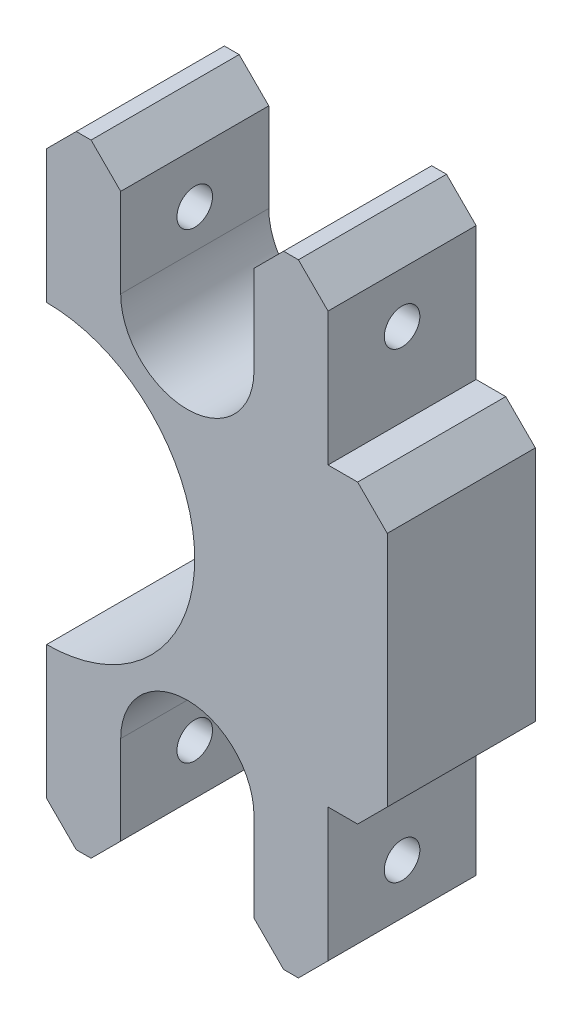
ISO-10303-21;
HEADER;
FILE_DESCRIPTION(('STEP AP214'),'2;1');
FILE_NAME('part.step','',(''),(''),'','','');
FILE_SCHEMA(('AUTOMOTIVE_DESIGN { 1 0 10303 214 1 1 1 1 }'));
ENDSEC;
DATA;
#1=APPLICATION_CONTEXT('core data for automotive mechanical design processes');
#2=APPLICATION_PROTOCOL_DEFINITION('international standard','automotive_design',2000,#1);
#3=PRODUCT_CONTEXT('',#1,'mechanical');
#4=PRODUCT('Part','Part','',(#3));
#5=PRODUCT_RELATED_PRODUCT_CATEGORY('part','',(#4));
#6=PRODUCT_DEFINITION_FORMATION('','',#4);
#7=PRODUCT_DEFINITION_CONTEXT('part definition',#1,'design');
#8=PRODUCT_DEFINITION('design','',#6,#7);
#9=PRODUCT_DEFINITION_SHAPE('','',#8);
#10=(LENGTH_UNIT() NAMED_UNIT(*) SI_UNIT(.MILLI.,.METRE.));
#11=(NAMED_UNIT(*) PLANE_ANGLE_UNIT() SI_UNIT($,.RADIAN.));
#12=(NAMED_UNIT(*) SI_UNIT($,.STERADIAN.) SOLID_ANGLE_UNIT());
#13=UNCERTAINTY_MEASURE_WITH_UNIT(LENGTH_MEASURE(1.E-05),#10,'distance_accuracy_value','');
#14=(GEOMETRIC_REPRESENTATION_CONTEXT(3) GLOBAL_UNCERTAINTY_ASSIGNED_CONTEXT((#13)) GLOBAL_UNIT_ASSIGNED_CONTEXT((#10,
#11,#12)) REPRESENTATION_CONTEXT('',''));
#15=CARTESIAN_POINT('',(0.,0.,0.));
#16=DIRECTION('',(0.,0.,1.));
#17=DIRECTION('',(1.,0.,0.));
#18=AXIS2_PLACEMENT_3D('',#15,#16,#17);
#19=CARTESIAN_POINT('',(0.,0.,25.));
#20=DIRECTION('',(0.,0.,-1.));
#21=DIRECTION('',(-1.,0.,0.));
#22=AXIS2_PLACEMENT_3D('',#19,#20,#21);
#23=CYLINDRICAL_SURFACE('',#22,50.);
#24=CARTESIAN_POINT('',(0.,0.,-25.));
#25=DIRECTION('',(0.,0.,-1.));
#26=DIRECTION('',(-1.,0.,0.));
#27=AXIS2_PLACEMENT_3D('',#24,#25,#26);
#28=CIRCLE('',#27,50.);
#29=CARTESIAN_POINT('',(0.,50.,-25.));
#30=VERTEX_POINT('',#29);
#31=CARTESIAN_POINT('',(0.,-50.,-25.));
#32=VERTEX_POINT('',#31);
#33=EDGE_CURVE('E246',#30,#32,#28,.T.);
#34=ORIENTED_EDGE('',*,*,#33,.T.);
#35=DIRECTION('',(0.,0.,-1.));
#36=VECTOR('',#35,1.);
#37=CARTESIAN_POINT('',(0.,-50.,25.));
#38=LINE('',#37,#36);
#39=CARTESIAN_POINT('',(0.,-50.,25.));
#40=VERTEX_POINT('',#39);
#41=EDGE_CURVE('E302',#40,#32,#38,.T.);
#42=ORIENTED_EDGE('',*,*,#41,.F.);
#43=CARTESIAN_POINT('',(0.,0.,25.));
#44=DIRECTION('',(0.,0.,-1.));
#45=DIRECTION('',(-1.,0.,0.));
#46=AXIS2_PLACEMENT_3D('',#43,#44,#45);
#47=CIRCLE('',#46,50.);
#48=CARTESIAN_POINT('',(0.,50.,25.));
#49=VERTEX_POINT('',#48);
#50=EDGE_CURVE('E279',#49,#40,#47,.T.);
#51=ORIENTED_EDGE('',*,*,#50,.F.);
#52=DIRECTION('',(0.,0.,-1.));
#53=VECTOR('',#52,1.);
#54=CARTESIAN_POINT('',(0.,50.,25.));
#55=LINE('',#54,#53);
#56=EDGE_CURVE('E258',#49,#30,#55,.T.);
#57=ORIENTED_EDGE('',*,*,#56,.T.);
#58=EDGE_LOOP('',(#34,#42,#51,#57));
#59=FACE_BOUND('',#58,.T.);
#60=ADVANCED_FACE('F45',(#59),#23,.F.);
#61=CARTESIAN_POINT('',(0.,-50.,25.));
#62=DIRECTION('',(1.,0.,0.));
#63=DIRECTION('',(0.,0.,-1.));
#64=AXIS2_PLACEMENT_3D('',#61,#62,#63);
#65=PLANE('',#64);
#66=CARTESIAN_POINT('',(0.,-78.,0.));
#67=DIRECTION('',(-1.,0.,0.));
#68=DIRECTION('',(0.,0.,-1.));
#69=AXIS2_PLACEMENT_3D('',#66,#67,#68);
#70=CIRCLE('',#69,6.);
#71=CARTESIAN_POINT('',(0.,-78.,-6.));
#72=VERTEX_POINT('',#71);
#73=EDGE_CURVE('E573',#72,#72,#70,.T.);
#74=ORIENTED_EDGE('',*,*,#73,.F.);
#75=EDGE_LOOP('',(#74));
#76=FACE_BOUND('',#75,.T.);
#77=DIRECTION('',(0.,-1.,0.));
#78=VECTOR('',#77,1.);
#79=CARTESIAN_POINT('',(0.,-50.,-25.));
#80=LINE('',#79,#78);
#81=CARTESIAN_POINT('',(0.,-94.9999999999999,-25.));
#82=VERTEX_POINT('',#81);
#83=EDGE_CURVE('E492',#32,#82,#80,.T.);
#84=ORIENTED_EDGE('',*,*,#83,.T.);
#85=DIRECTION('',(0.,0.,1.));
#86=VECTOR('',#85,1.);
#87=CARTESIAN_POINT('',(0.,-94.9999999999999,25.));
#88=LINE('',#87,#86);
#89=CARTESIAN_POINT('',(0.,-94.9999999999999,25.));
#90=VERTEX_POINT('',#89);
#91=EDGE_CURVE('E408',#82,#90,#88,.T.);
#92=ORIENTED_EDGE('',*,*,#91,.T.);
#93=DIRECTION('',(0.,-1.,0.));
#94=VECTOR('',#93,1.);
#95=CARTESIAN_POINT('',(0.,-50.,25.));
#96=LINE('',#95,#94);
#97=EDGE_CURVE('E537',#40,#90,#96,.T.);
#98=ORIENTED_EDGE('',*,*,#97,.F.);
#99=ORIENTED_EDGE('',*,*,#41,.T.);
#100=EDGE_LOOP('',(#84,#92,#98,#99));
#101=FACE_BOUND('',#100,.T.);
#102=ADVANCED_FACE('F618',(#76,#101),#65,.F.);
#103=CARTESIAN_POINT('',(0.,-105.,25.));
#104=DIRECTION('',(0.,1.,0.));
#105=DIRECTION('',(0.,0.,1.));
#106=AXIS2_PLACEMENT_3D('',#103,#104,#105);
#107=PLANE('',#106);
#108=DIRECTION('',(1.,0.,0.));
#109=VECTOR('',#108,1.);
#110=CARTESIAN_POINT('',(0.,-105.,-25.));
#111=LINE('',#110,#109);
#112=CARTESIAN_POINT('',(10.,-105.,-25.));
#113=VERTEX_POINT('',#112);
#114=CARTESIAN_POINT('',(15.,-105.,-25.));
#115=VERTEX_POINT('',#114);
#116=EDGE_CURVE('E488',#113,#115,#111,.T.);
#117=ORIENTED_EDGE('',*,*,#116,.T.);
#118=DIRECTION('',(0.,0.,1.));
#119=VECTOR('',#118,1.);
#120=CARTESIAN_POINT('',(15.,-105.,25.));
#121=LINE('',#120,#119);
#122=CARTESIAN_POINT('',(15.,-105.,25.));
#123=VERTEX_POINT('',#122);
#124=EDGE_CURVE('E405',#115,#123,#121,.T.);
#125=ORIENTED_EDGE('',*,*,#124,.T.);
#126=DIRECTION('',(1.,0.,0.));
#127=VECTOR('',#126,1.);
#128=CARTESIAN_POINT('',(0.,-105.,25.));
#129=LINE('',#128,#127);
#130=CARTESIAN_POINT('',(10.,-105.,25.));
#131=VERTEX_POINT('',#130);
#132=EDGE_CURVE('E534',#131,#123,#129,.T.);
#133=ORIENTED_EDGE('',*,*,#132,.F.);
#134=DIRECTION('',(0.,0.,-1.));
#135=VECTOR('',#134,1.);
#136=CARTESIAN_POINT('',(10.,-105.,25.));
#137=LINE('',#136,#135);
#138=EDGE_CURVE('E401',#131,#113,#137,.T.);
#139=ORIENTED_EDGE('',*,*,#138,.T.);
#140=EDGE_LOOP('',(#117,#125,#133,#139));
#141=FACE_BOUND('',#140,.T.);
#142=ADVANCED_FACE('F624',(#141),#107,.F.);
#143=CARTESIAN_POINT('',(25.,-105.,25.));
#144=DIRECTION('',(-1.,0.,0.));
#145=DIRECTION('',(0.,-1.,0.));
#146=AXIS2_PLACEMENT_3D('',#143,#144,#145);
#147=PLANE('',#146);
#148=CARTESIAN_POINT('',(25.,-78.,0.));
#149=DIRECTION('',(-1.,0.,0.));
#150=DIRECTION('',(0.,-1.,0.));
#151=AXIS2_PLACEMENT_3D('',#148,#149,#150);
#152=CIRCLE('',#151,6.);
#153=CARTESIAN_POINT('',(25.,-84.,0.));
#154=VERTEX_POINT('',#153);
#155=EDGE_CURVE('E549',#154,#154,#152,.T.);
#156=ORIENTED_EDGE('',*,*,#155,.T.);
#157=EDGE_LOOP('',(#156));
#158=FACE_BOUND('',#157,.T.);
#159=DIRECTION('',(0.,1.,0.));
#160=VECTOR('',#159,1.);
#161=CARTESIAN_POINT('',(25.,-105.,25.));
#162=LINE('',#161,#160);
#163=CARTESIAN_POINT('',(25.,-95.,25.));
#164=VERTEX_POINT('',#163);
#165=CARTESIAN_POINT('',(25.,-65.,25.));
#166=VERTEX_POINT('',#165);
#167=EDGE_CURVE('E531',#164,#166,#162,.T.);
#168=ORIENTED_EDGE('',*,*,#167,.F.);
#169=DIRECTION('',(0.,0.,-1.));
#170=VECTOR('',#169,1.);
#171=CARTESIAN_POINT('',(25.,-95.,25.));
#172=LINE('',#171,#170);
#173=CARTESIAN_POINT('',(25.,-95.,-25.));
#174=VERTEX_POINT('',#173);
#175=EDGE_CURVE('E397',#164,#174,#172,.T.);
#176=ORIENTED_EDGE('',*,*,#175,.T.);
#177=DIRECTION('',(0.,1.,0.));
#178=VECTOR('',#177,1.);
#179=CARTESIAN_POINT('',(25.,-105.,-25.));
#180=LINE('',#179,#178);
#181=CARTESIAN_POINT('',(25.,-65.,-25.));
#182=VERTEX_POINT('',#181);
#183=EDGE_CURVE('E485',#174,#182,#180,.T.);
#184=ORIENTED_EDGE('',*,*,#183,.T.);
#185=DIRECTION('',(0.,0.,-1.));
#186=VECTOR('',#185,1.);
#187=CARTESIAN_POINT('',(25.,-65.,25.));
#188=LINE('',#187,#186);
#189=EDGE_CURVE('E298',#166,#182,#188,.T.);
#190=ORIENTED_EDGE('',*,*,#189,.F.);
#191=EDGE_LOOP('',(#168,#176,#184,#190));
#192=FACE_BOUND('',#191,.T.);
#193=ADVANCED_FACE('F727',(#158,#192),#147,.F.);
#194=CARTESIAN_POINT('',(70.,-65.,25.));
#195=DIRECTION('',(1.,0.,0.));
#196=DIRECTION('',(0.,0.,-1.));
#197=AXIS2_PLACEMENT_3D('',#194,#195,#196);
#198=PLANE('',#197);
#199=CARTESIAN_POINT('',(70.,-78.,0.));
#200=DIRECTION('',(1.,0.,0.));
#201=DIRECTION('',(0.,0.,-1.));
#202=AXIS2_PLACEMENT_3D('',#199,#200,#201);
#203=CIRCLE('',#202,6.);
#204=CARTESIAN_POINT('',(70.,-78.,-6.));
#205=VERTEX_POINT('',#204);
#206=EDGE_CURVE('E311',#205,#205,#203,.T.);
#207=ORIENTED_EDGE('',*,*,#206,.T.);
#208=EDGE_LOOP('',(#207));
#209=FACE_BOUND('',#208,.T.);
#210=DIRECTION('',(0.,-1.,0.));
#211=VECTOR('',#210,1.);
#212=CARTESIAN_POINT('',(70.,-65.,-25.));
#213=LINE('',#212,#211);
#214=CARTESIAN_POINT('',(70.,-65.,-25.));
#215=VERTEX_POINT('',#214);
#216=CARTESIAN_POINT('',(70.,-95.,-25.));
#217=VERTEX_POINT('',#216);
#218=EDGE_CURVE('E482',#215,#217,#213,.T.);
#219=ORIENTED_EDGE('',*,*,#218,.T.);
#220=DIRECTION('',(0.,0.,1.));
#221=VECTOR('',#220,1.);
#222=CARTESIAN_POINT('',(70.,-95.,25.));
#223=LINE('',#222,#221);
#224=CARTESIAN_POINT('',(70.,-95.,25.));
#225=VERTEX_POINT('',#224);
#226=EDGE_CURVE('E62',#217,#225,#223,.T.);
#227=ORIENTED_EDGE('',*,*,#226,.T.);
#228=DIRECTION('',(0.,-1.,0.));
#229=VECTOR('',#228,1.);
#230=CARTESIAN_POINT('',(70.,-65.,25.));
#231=LINE('',#230,#229);
#232=CARTESIAN_POINT('',(70.,-65.,25.));
#233=VERTEX_POINT('',#232);
#234=EDGE_CURVE('E528',#233,#225,#231,.T.);
#235=ORIENTED_EDGE('',*,*,#234,.F.);
#236=DIRECTION('',(0.,0.,-1.));
#237=VECTOR('',#236,1.);
#238=CARTESIAN_POINT('',(70.,-65.,25.));
#239=LINE('',#238,#237);
#240=EDGE_CURVE('E294',#233,#215,#239,.T.);
#241=ORIENTED_EDGE('',*,*,#240,.T.);
#242=EDGE_LOOP('',(#219,#227,#235,#241));
#243=FACE_BOUND('',#242,.T.);
#244=ADVANCED_FACE('F720',(#209,#243),#198,.F.);
#245=CARTESIAN_POINT('',(70.,-105.,25.));
#246=DIRECTION('',(0.,1.,0.));
#247=DIRECTION('',(0.,0.,1.));
#248=AXIS2_PLACEMENT_3D('',#245,#246,#247);
#249=PLANE('',#248);
#250=DIRECTION('',(1.,0.,0.));
#251=VECTOR('',#250,1.);
#252=CARTESIAN_POINT('',(70.,-105.,-25.));
#253=LINE('',#252,#251);
#254=CARTESIAN_POINT('',(80.,-105.,-25.));
#255=VERTEX_POINT('',#254);
#256=CARTESIAN_POINT('',(85.,-105.,-25.));
#257=VERTEX_POINT('',#256);
#258=EDGE_CURVE('E478',#255,#257,#253,.T.);
#259=ORIENTED_EDGE('',*,*,#258,.T.);
#260=DIRECTION('',(0.,0.,1.));
#261=VECTOR('',#260,1.);
#262=CARTESIAN_POINT('',(85.,-105.,25.));
#263=LINE('',#262,#261);
#264=CARTESIAN_POINT('',(85.,-105.,25.));
#265=VERTEX_POINT('',#264);
#266=EDGE_CURVE('E369',#257,#265,#263,.T.);
#267=ORIENTED_EDGE('',*,*,#266,.T.);
#268=DIRECTION('',(1.,0.,0.));
#269=VECTOR('',#268,1.);
#270=CARTESIAN_POINT('',(70.,-105.,25.));
#271=LINE('',#270,#269);
#272=CARTESIAN_POINT('',(80.,-105.,25.));
#273=VERTEX_POINT('',#272);
#274=EDGE_CURVE('E525',#273,#265,#271,.T.);
#275=ORIENTED_EDGE('',*,*,#274,.F.);
#276=DIRECTION('',(0.,0.,-1.));
#277=VECTOR('',#276,1.);
#278=CARTESIAN_POINT('',(80.,-105.,25.));
#279=LINE('',#278,#277);
#280=EDGE_CURVE('E365',#273,#255,#279,.T.);
#281=ORIENTED_EDGE('',*,*,#280,.T.);
#282=EDGE_LOOP('',(#259,#267,#275,#281));
#283=FACE_BOUND('',#282,.T.);
#284=ADVANCED_FACE('F714',(#283),#249,.F.);
#285=CARTESIAN_POINT('',(95.,-105.,25.));
#286=DIRECTION('',(-1.,0.,0.));
#287=DIRECTION('',(0.,-1.,0.));
#288=AXIS2_PLACEMENT_3D('',#285,#286,#287);
#289=PLANE('',#288);
#290=CARTESIAN_POINT('',(95.,-78.,0.));
#291=DIRECTION('',(-1.,0.,0.));
#292=DIRECTION('',(0.,-1.,0.));
#293=AXIS2_PLACEMENT_3D('',#290,#291,#292);
#294=CIRCLE('',#293,6.);
#295=CARTESIAN_POINT('',(95.,-84.,0.));
#296=VERTEX_POINT('',#295);
#297=EDGE_CURVE('E307',#296,#296,#294,.T.);
#298=ORIENTED_EDGE('',*,*,#297,.T.);
#299=EDGE_LOOP('',(#298));
#300=FACE_BOUND('',#299,.T.);
#301=DIRECTION('',(0.,1.,0.));
#302=VECTOR('',#301,1.);
#303=CARTESIAN_POINT('',(95.,-105.,25.));
#304=LINE('',#303,#302);
#305=CARTESIAN_POINT('',(95.,-95.,25.));
#306=VERTEX_POINT('',#305);
#307=CARTESIAN_POINT('',(95.,-50.,25.));
#308=VERTEX_POINT('',#307);
#309=EDGE_CURVE('E522',#306,#308,#304,.T.);
#310=ORIENTED_EDGE('',*,*,#309,.F.);
#311=DIRECTION('',(0.,0.,-1.));
#312=VECTOR('',#311,1.);
#313=CARTESIAN_POINT('',(95.,-95.,25.));
#314=LINE('',#313,#312);
#315=CARTESIAN_POINT('',(95.,-95.,-25.));
#316=VERTEX_POINT('',#315);
#317=EDGE_CURVE('E338',#306,#316,#314,.T.);
#318=ORIENTED_EDGE('',*,*,#317,.T.);
#319=DIRECTION('',(0.,1.,0.));
#320=VECTOR('',#319,1.);
#321=CARTESIAN_POINT('',(95.,-105.,-25.));
#322=LINE('',#321,#320);
#323=CARTESIAN_POINT('',(95.,-50.,-25.));
#324=VERTEX_POINT('',#323);
#325=EDGE_CURVE('E475',#316,#324,#322,.T.);
#326=ORIENTED_EDGE('',*,*,#325,.T.);
#327=DIRECTION('',(0.,0.,-1.));
#328=VECTOR('',#327,1.);
#329=CARTESIAN_POINT('',(95.,-50.,25.));
#330=LINE('',#329,#328);
#331=EDGE_CURVE('E290',#308,#324,#330,.T.);
#332=ORIENTED_EDGE('',*,*,#331,.F.);
#333=EDGE_LOOP('',(#310,#318,#326,#332));
#334=FACE_BOUND('',#333,.T.);
#335=ADVANCED_FACE('F709',(#300,#334),#289,.F.);
#336=CARTESIAN_POINT('',(95.,-50.,25.));
#337=DIRECTION('',(0.,1.,0.));
#338=DIRECTION('',(-1.,0.,0.));
#339=AXIS2_PLACEMENT_3D('',#336,#337,#338);
#340=PLANE('',#339);
#341=DIRECTION('',(1.,0.,0.));
#342=VECTOR('',#341,1.);
#343=CARTESIAN_POINT('',(95.,-50.,-25.));
#344=LINE('',#343,#342);
#345=CARTESIAN_POINT('',(105.,-50.,-25.));
#346=VERTEX_POINT('',#345);
#347=EDGE_CURVE('E471',#324,#346,#344,.T.);
#348=ORIENTED_EDGE('',*,*,#347,.T.);
#349=DIRECTION('',(0.,0.,1.));
#350=VECTOR('',#349,1.);
#351=CARTESIAN_POINT('',(105.,-50.,25.));
#352=LINE('',#351,#350);
#353=CARTESIAN_POINT('',(105.,-50.,25.));
#354=VERTEX_POINT('',#353);
#355=EDGE_CURVE('E325',#346,#354,#352,.T.);
#356=ORIENTED_EDGE('',*,*,#355,.T.);
#357=DIRECTION('',(1.,0.,0.));
#358=VECTOR('',#357,1.);
#359=CARTESIAN_POINT('',(95.,-50.,25.));
#360=LINE('',#359,#358);
#361=EDGE_CURVE('E518',#308,#354,#360,.T.);
#362=ORIENTED_EDGE('',*,*,#361,.F.);
#363=ORIENTED_EDGE('',*,*,#331,.T.);
#364=EDGE_LOOP('',(#348,#356,#362,#363));
#365=FACE_BOUND('',#364,.T.);
#366=ADVANCED_FACE('F704',(#365),#340,.F.);
#367=CARTESIAN_POINT('',(115.,50.,25.));
#368=DIRECTION('',(-1.,0.,0.));
#369=DIRECTION('',(0.,0.,1.));
#370=AXIS2_PLACEMENT_3D('',#367,#368,#369);
#371=PLANE('',#370);
#372=DIRECTION('',(0.,1.,0.));
#373=VECTOR('',#372,1.);
#374=CARTESIAN_POINT('',(115.,50.,25.));
#375=LINE('',#374,#373);
#376=CARTESIAN_POINT('',(115.,-39.9999999999999,25.));
#377=VERTEX_POINT('',#376);
#378=CARTESIAN_POINT('',(115.,40.,25.));
#379=VERTEX_POINT('',#378);
#380=EDGE_CURVE('E514',#377,#379,#375,.T.);
#381=ORIENTED_EDGE('',*,*,#380,.F.);
#382=DIRECTION('',(0.,0.,-1.));
#383=VECTOR('',#382,1.);
#384=CARTESIAN_POINT('',(115.,-40.,25.));
#385=LINE('',#384,#383);
#386=CARTESIAN_POINT('',(115.,-39.9999999999999,-25.));
#387=VERTEX_POINT('',#386);
#388=EDGE_CURVE('E315',#377,#387,#385,.T.);
#389=ORIENTED_EDGE('',*,*,#388,.T.);
#390=DIRECTION('',(0.,1.,0.));
#391=VECTOR('',#390,1.);
#392=CARTESIAN_POINT('',(115.,50.,-25.));
#393=LINE('',#392,#391);
#394=CARTESIAN_POINT('',(115.,40.,-25.));
#395=VERTEX_POINT('',#394);
#396=EDGE_CURVE('E467',#387,#395,#393,.T.);
#397=ORIENTED_EDGE('',*,*,#396,.T.);
#398=DIRECTION('',(0.,0.,1.));
#399=VECTOR('',#398,1.);
#400=CARTESIAN_POINT('',(115.,40.,25.));
#401=LINE('',#400,#399);
#402=EDGE_CURVE('E306',#395,#379,#401,.T.);
#403=ORIENTED_EDGE('',*,*,#402,.T.);
#404=EDGE_LOOP('',(#381,#389,#397,#403));
#405=FACE_BOUND('',#404,.T.);
#406=ADVANCED_FACE('F698',(#405),#371,.F.);
#407=CARTESIAN_POINT('',(95.,50.,25.));
#408=DIRECTION('',(0.,-1.,0.));
#409=DIRECTION('',(1.,0.,0.));
#410=AXIS2_PLACEMENT_3D('',#407,#408,#409);
#411=PLANE('',#410);
#412=DIRECTION('',(-1.,0.,0.));
#413=VECTOR('',#412,1.);
#414=CARTESIAN_POINT('',(95.,50.,25.));
#415=LINE('',#414,#413);
#416=CARTESIAN_POINT('',(105.,50.,25.));
#417=VERTEX_POINT('',#416);
#418=CARTESIAN_POINT('',(95.,50.,25.));
#419=VERTEX_POINT('',#418);
#420=EDGE_CURVE('E511',#417,#419,#415,.T.);
#421=ORIENTED_EDGE('',*,*,#420,.F.);
#422=DIRECTION('',(0.,0.,-1.));
#423=VECTOR('',#422,1.);
#424=CARTESIAN_POINT('',(105.,50.,25.));
#425=LINE('',#424,#423);
#426=CARTESIAN_POINT('',(105.,50.,-25.));
#427=VERTEX_POINT('',#426);
#428=EDGE_CURVE('E334',#417,#427,#425,.T.);
#429=ORIENTED_EDGE('',*,*,#428,.T.);
#430=DIRECTION('',(-1.,0.,0.));
#431=VECTOR('',#430,1.);
#432=CARTESIAN_POINT('',(95.,50.,-25.));
#433=LINE('',#432,#431);
#434=CARTESIAN_POINT('',(95.,50.,-25.));
#435=VERTEX_POINT('',#434);
#436=EDGE_CURVE('E462',#427,#435,#433,.T.);
#437=ORIENTED_EDGE('',*,*,#436,.T.);
#438=DIRECTION('',(0.,0.,-1.));
#439=VECTOR('',#438,1.);
#440=CARTESIAN_POINT('',(95.,50.,25.));
#441=LINE('',#440,#439);
#442=EDGE_CURVE('E286',#419,#435,#441,.T.);
#443=ORIENTED_EDGE('',*,*,#442,.F.);
#444=EDGE_LOOP('',(#421,#429,#437,#443));
#445=FACE_BOUND('',#444,.T.);
#446=ADVANCED_FACE('F692',(#445),#411,.F.);
#447=CARTESIAN_POINT('',(95.,105.,25.));
#448=DIRECTION('',(-1.,0.,0.));
#449=DIRECTION('',(0.,-1.,0.));
#450=AXIS2_PLACEMENT_3D('',#447,#448,#449);
#451=PLANE('',#450);
#452=CARTESIAN_POINT('',(95.,78.,0.));
#453=DIRECTION('',(-1.,0.,0.));
#454=DIRECTION('',(0.,-1.,0.));
#455=AXIS2_PLACEMENT_3D('',#452,#453,#454);
#456=CIRCLE('',#455,6.);
#457=CARTESIAN_POINT('',(95.,72.,0.));
#458=VERTEX_POINT('',#457);
#459=EDGE_CURVE('E312',#458,#458,#456,.T.);
#460=ORIENTED_EDGE('',*,*,#459,.T.);
#461=EDGE_LOOP('',(#460));
#462=FACE_BOUND('',#461,.T.);
#463=DIRECTION('',(0.,1.,0.));
#464=VECTOR('',#463,1.);
#465=CARTESIAN_POINT('',(95.,105.,-25.));
#466=LINE('',#465,#464);
#467=CARTESIAN_POINT('',(95.,95.,-25.));
#468=VERTEX_POINT('',#467);
#469=EDGE_CURVE('E460',#435,#468,#466,.T.);
#470=ORIENTED_EDGE('',*,*,#469,.T.);
#471=DIRECTION('',(0.,0.,1.));
#472=VECTOR('',#471,1.);
#473=CARTESIAN_POINT('',(95.,95.,25.));
#474=LINE('',#473,#472);
#475=CARTESIAN_POINT('',(95.,95.,25.));
#476=VERTEX_POINT('',#475);
#477=EDGE_CURVE('E11',#468,#476,#474,.T.);
#478=ORIENTED_EDGE('',*,*,#477,.T.);
#479=DIRECTION('',(0.,1.,0.));
#480=VECTOR('',#479,1.);
#481=CARTESIAN_POINT('',(95.,105.,25.));
#482=LINE('',#481,#480);
#483=EDGE_CURVE('E451',#419,#476,#482,.T.);
#484=ORIENTED_EDGE('',*,*,#483,.F.);
#485=ORIENTED_EDGE('',*,*,#442,.T.);
#486=EDGE_LOOP('',(#470,#478,#484,#485));
#487=FACE_BOUND('',#486,.T.);
#488=ADVANCED_FACE('F686',(#462,#487),#451,.F.);
#489=CARTESIAN_POINT('',(70.,105.,25.));
#490=DIRECTION('',(0.,-1.,0.));
#491=DIRECTION('',(0.,0.,-1.));
#492=AXIS2_PLACEMENT_3D('',#489,#490,#491);
#493=PLANE('',#492);
#494=DIRECTION('',(-1.,0.,0.));
#495=VECTOR('',#494,1.);
#496=CARTESIAN_POINT('',(70.,105.,-25.));
#497=LINE('',#496,#495);
#498=CARTESIAN_POINT('',(85.,105.,-25.));
#499=VERTEX_POINT('',#498);
#500=CARTESIAN_POINT('',(80.,105.,-25.));
#501=VERTEX_POINT('',#500);
#502=EDGE_CURVE('E273',#499,#501,#497,.T.);
#503=ORIENTED_EDGE('',*,*,#502,.T.);
#504=DIRECTION('',(0.,0.,1.));
#505=VECTOR('',#504,1.);
#506=CARTESIAN_POINT('',(80.,105.,25.));
#507=LINE('',#506,#505);
#508=CARTESIAN_POINT('',(80.,105.,25.));
#509=VERTEX_POINT('',#508);
#510=EDGE_CURVE('E55',#501,#509,#507,.T.);
#511=ORIENTED_EDGE('',*,*,#510,.T.);
#512=DIRECTION('',(-1.,0.,0.));
#513=VECTOR('',#512,1.);
#514=CARTESIAN_POINT('',(70.,105.,25.));
#515=LINE('',#514,#513);
#516=CARTESIAN_POINT('',(85.,105.,25.));
#517=VERTEX_POINT('',#516);
#518=EDGE_CURVE('E439',#517,#509,#515,.T.);
#519=ORIENTED_EDGE('',*,*,#518,.F.);
#520=DIRECTION('',(0.,0.,-1.));
#521=VECTOR('',#520,1.);
#522=CARTESIAN_POINT('',(85.,105.,25.));
#523=LINE('',#522,#521);
#524=EDGE_CURVE('E429',#517,#499,#523,.T.);
#525=ORIENTED_EDGE('',*,*,#524,.T.);
#526=EDGE_LOOP('',(#503,#511,#519,#525));
#527=FACE_BOUND('',#526,.T.);
#528=ADVANCED_FACE('F438',(#527),#493,.F.);
#529=CARTESIAN_POINT('',(70.,65.,25.));
#530=DIRECTION('',(1.,0.,0.));
#531=DIRECTION('',(0.,0.,-1.));
#532=AXIS2_PLACEMENT_3D('',#529,#530,#531);
#533=PLANE('',#532);
#534=CARTESIAN_POINT('',(70.,78.,0.));
#535=DIRECTION('',(1.,0.,0.));
#536=DIRECTION('',(0.,0.,-1.));
#537=AXIS2_PLACEMENT_3D('',#534,#535,#536);
#538=CIRCLE('',#537,6.);
#539=CARTESIAN_POINT('',(70.,78.,-6.));
#540=VERTEX_POINT('',#539);
#541=EDGE_CURVE('E564',#540,#540,#538,.T.);
#542=ORIENTED_EDGE('',*,*,#541,.T.);
#543=EDGE_LOOP('',(#542));
#544=FACE_BOUND('',#543,.T.);
#545=DIRECTION('',(0.,-1.,0.));
#546=VECTOR('',#545,1.);
#547=CARTESIAN_POINT('',(70.,65.,25.));
#548=LINE('',#547,#546);
#549=CARTESIAN_POINT('',(70.,95.,25.));
#550=VERTEX_POINT('',#549);
#551=CARTESIAN_POINT('',(70.,65.,25.));
#552=VERTEX_POINT('',#551);
#553=EDGE_CURVE('E450',#550,#552,#548,.T.);
#554=ORIENTED_EDGE('',*,*,#553,.F.);
#555=DIRECTION('',(0.,0.,-1.));
#556=VECTOR('',#555,1.);
#557=CARTESIAN_POINT('',(70.,95.,25.));
#558=LINE('',#557,#556);
#559=CARTESIAN_POINT('',(70.,95.,-25.));
#560=VERTEX_POINT('',#559);
#561=EDGE_CURVE('E425',#550,#560,#558,.T.);
#562=ORIENTED_EDGE('',*,*,#561,.T.);
#563=DIRECTION('',(0.,-1.,0.));
#564=VECTOR('',#563,1.);
#565=CARTESIAN_POINT('',(70.,65.,-25.));
#566=LINE('',#565,#564);
#567=CARTESIAN_POINT('',(70.,65.,-25.));
#568=VERTEX_POINT('',#567);
#569=EDGE_CURVE('E266',#560,#568,#566,.T.);
#570=ORIENTED_EDGE('',*,*,#569,.T.);
#571=DIRECTION('',(0.,0.,-1.));
#572=VECTOR('',#571,1.);
#573=CARTESIAN_POINT('',(70.,65.,25.));
#574=LINE('',#573,#572);
#575=EDGE_CURVE('E241',#552,#568,#574,.T.);
#576=ORIENTED_EDGE('',*,*,#575,.F.);
#577=EDGE_LOOP('',(#554,#562,#570,#576));
#578=FACE_BOUND('',#577,.T.);
#579=ADVANCED_FACE('F456',(#544,#578),#533,.F.);
#580=CARTESIAN_POINT('',(25.,105.,25.));
#581=DIRECTION('',(-1.,0.,0.));
#582=DIRECTION('',(0.,-1.,0.));
#583=AXIS2_PLACEMENT_3D('',#580,#581,#582);
#584=PLANE('',#583);
#585=CARTESIAN_POINT('',(25.,78.,0.));
#586=DIRECTION('',(-1.,0.,0.));
#587=DIRECTION('',(0.,-1.,0.));
#588=AXIS2_PLACEMENT_3D('',#585,#586,#587);
#589=CIRCLE('',#588,6.);
#590=CARTESIAN_POINT('',(25.,72.,0.));
#591=VERTEX_POINT('',#590);
#592=EDGE_CURVE('E568',#591,#591,#589,.T.);
#593=ORIENTED_EDGE('',*,*,#592,.T.);
#594=EDGE_LOOP('',(#593));
#595=FACE_BOUND('',#594,.T.);
#596=DIRECTION('',(0.,1.,0.));
#597=VECTOR('',#596,1.);
#598=CARTESIAN_POINT('',(25.,105.,-25.));
#599=LINE('',#598,#597);
#600=CARTESIAN_POINT('',(25.,65.,-25.));
#601=VERTEX_POINT('',#600);
#602=CARTESIAN_POINT('',(25.,94.9999999999999,-25.));
#603=VERTEX_POINT('',#602);
#604=EDGE_CURVE('E253',#601,#603,#599,.T.);
#605=ORIENTED_EDGE('',*,*,#604,.T.);
#606=DIRECTION('',(0.,0.,1.));
#607=VECTOR('',#606,1.);
#608=CARTESIAN_POINT('',(25.,94.9999999999999,25.));
#609=LINE('',#608,#607);
#610=CARTESIAN_POINT('',(25.,94.9999999999999,25.));
#611=VERTEX_POINT('',#610);
#612=EDGE_CURVE('E418',#603,#611,#609,.T.);
#613=ORIENTED_EDGE('',*,*,#612,.T.);
#614=DIRECTION('',(0.,1.,0.));
#615=VECTOR('',#614,1.);
#616=CARTESIAN_POINT('',(25.,105.,25.));
#617=LINE('',#616,#615);
#618=CARTESIAN_POINT('',(25.,65.,25.));
#619=VERTEX_POINT('',#618);
#620=EDGE_CURVE('E256',#619,#611,#617,.T.);
#621=ORIENTED_EDGE('',*,*,#620,.F.);
#622=DIRECTION('',(0.,0.,-1.));
#623=VECTOR('',#622,1.);
#624=CARTESIAN_POINT('',(25.,65.,25.));
#625=LINE('',#624,#623);
#626=EDGE_CURVE('E238',#619,#601,#625,.T.);
#627=ORIENTED_EDGE('',*,*,#626,.T.);
#628=EDGE_LOOP('',(#605,#613,#621,#627));
#629=FACE_BOUND('',#628,.T.);
#630=ADVANCED_FACE('F252',(#595,#629),#584,.F.);
#631=CARTESIAN_POINT('',(0.,105.,25.));
#632=DIRECTION('',(0.,-1.,0.));
#633=DIRECTION('',(0.,0.,-1.));
#634=AXIS2_PLACEMENT_3D('',#631,#632,#633);
#635=PLANE('',#634);
#636=DIRECTION('',(-1.,0.,0.));
#637=VECTOR('',#636,1.);
#638=CARTESIAN_POINT('',(0.,105.,25.));
#639=LINE('',#638,#637);
#640=CARTESIAN_POINT('',(15.,105.,25.));
#641=VERTEX_POINT('',#640);
#642=CARTESIAN_POINT('',(10.0000000000001,105.,25.));
#643=VERTEX_POINT('',#642);
#644=EDGE_CURVE('E501',#641,#643,#639,.T.);
#645=ORIENTED_EDGE('',*,*,#644,.F.);
#646=DIRECTION('',(0.,0.,-1.));
#647=VECTOR('',#646,1.);
#648=CARTESIAN_POINT('',(15.,105.,25.));
#649=LINE('',#648,#647);
#650=CARTESIAN_POINT('',(15.,105.,-25.));
#651=VERTEX_POINT('',#650);
#652=EDGE_CURVE('E414',#641,#651,#649,.T.);
#653=ORIENTED_EDGE('',*,*,#652,.T.);
#654=DIRECTION('',(-1.,0.,0.));
#655=VECTOR('',#654,1.);
#656=CARTESIAN_POINT('',(0.,105.,-25.));
#657=LINE('',#656,#655);
#658=CARTESIAN_POINT('',(10.0000000000001,105.,-25.));
#659=VERTEX_POINT('',#658);
#660=EDGE_CURVE('E265',#651,#659,#657,.T.);
#661=ORIENTED_EDGE('',*,*,#660,.T.);
#662=DIRECTION('',(0.,0.,1.));
#663=VECTOR('',#662,1.);
#664=CARTESIAN_POINT('',(10.0000000000001,105.,25.));
#665=LINE('',#664,#663);
#666=EDGE_CURVE('E411',#659,#643,#665,.T.);
#667=ORIENTED_EDGE('',*,*,#666,.T.);
#668=EDGE_LOOP('',(#645,#653,#661,#667));
#669=FACE_BOUND('',#668,.T.);
#670=ADVANCED_FACE('F587',(#669),#635,.F.);
#671=CARTESIAN_POINT('',(0.,50.,25.));
#672=DIRECTION('',(1.,0.,0.));
#673=DIRECTION('',(0.,0.,-1.));
#674=AXIS2_PLACEMENT_3D('',#671,#672,#673);
#675=PLANE('',#674);
#676=CARTESIAN_POINT('',(0.,78.,0.));
#677=DIRECTION('',(-1.,0.,0.));
#678=DIRECTION('',(0.,0.,1.));
#679=AXIS2_PLACEMENT_3D('',#676,#677,#678);
#680=CIRCLE('',#679,6.);
#681=CARTESIAN_POINT('',(0.,78.,6.));
#682=VERTEX_POINT('',#681);
#683=EDGE_CURVE('E572',#682,#682,#680,.T.);
#684=ORIENTED_EDGE('',*,*,#683,.F.);
#685=EDGE_LOOP('',(#684));
#686=FACE_BOUND('',#685,.T.);
#687=DIRECTION('',(0.,-1.,0.));
#688=VECTOR('',#687,1.);
#689=CARTESIAN_POINT('',(0.,50.,25.));
#690=LINE('',#689,#688);
#691=CARTESIAN_POINT('',(0.,95.,25.));
#692=VERTEX_POINT('',#691);
#693=EDGE_CURVE('E282',#692,#49,#690,.T.);
#694=ORIENTED_EDGE('',*,*,#693,.F.);
#695=DIRECTION('',(0.,0.,-1.));
#696=VECTOR('',#695,1.);
#697=CARTESIAN_POINT('',(0.,95.,25.));
#698=LINE('',#697,#696);
#699=CARTESIAN_POINT('',(0.,95.,-25.));
#700=VERTEX_POINT('',#699);
#701=EDGE_CURVE('E421',#692,#700,#698,.T.);
#702=ORIENTED_EDGE('',*,*,#701,.T.);
#703=DIRECTION('',(0.,-1.,0.));
#704=VECTOR('',#703,1.);
#705=CARTESIAN_POINT('',(0.,50.,-25.));
#706=LINE('',#705,#704);
#707=EDGE_CURVE('E271',#700,#30,#706,.T.);
#708=ORIENTED_EDGE('',*,*,#707,.T.);
#709=ORIENTED_EDGE('',*,*,#56,.F.);
#710=EDGE_LOOP('',(#694,#702,#708,#709));
#711=FACE_BOUND('',#710,.T.);
#712=ADVANCED_FACE('F584',(#686,#711),#675,.F.);
#713=CARTESIAN_POINT('',(0.,0.,25.));
#714=DIRECTION('',(0.,0.,-1.));
#715=DIRECTION('',(-1.,0.,0.));
#716=AXIS2_PLACEMENT_3D('',#713,#714,#715);
#717=PLANE('',#716);
#718=ORIENTED_EDGE('',*,*,#274,.T.);
#719=DIRECTION('',(-0.707106781186549,-0.707106781186547,0.));
#720=VECTOR('',#719,1.);
#721=CARTESIAN_POINT('',(95.,-95.,25.));
#722=LINE('',#721,#720);
#723=EDGE_CURVE('E392',#265,#306,#722,.F.);
#724=ORIENTED_EDGE('',*,*,#723,.T.);
#725=ORIENTED_EDGE('',*,*,#309,.T.);
#726=ORIENTED_EDGE('',*,*,#361,.T.);
#727=DIRECTION('',(-0.707106781186548,-0.707106781186547,0.));
#728=VECTOR('',#727,1.);
#729=CARTESIAN_POINT('',(115.,-40.,25.));
#730=LINE('',#729,#728);
#731=EDGE_CURVE('E331',#354,#377,#730,.F.);
#732=ORIENTED_EDGE('',*,*,#731,.T.);
#733=ORIENTED_EDGE('',*,*,#380,.T.);
#734=DIRECTION('',(0.707106781186546,-0.707106781186549,0.));
#735=VECTOR('',#734,1.);
#736=CARTESIAN_POINT('',(105.,50.,25.));
#737=LINE('',#736,#735);
#738=EDGE_CURVE('E328',#379,#417,#737,.F.);
#739=ORIENTED_EDGE('',*,*,#738,.T.);
#740=ORIENTED_EDGE('',*,*,#420,.T.);
#741=ORIENTED_EDGE('',*,*,#483,.T.);
#742=DIRECTION('',(0.707106781186547,-0.707106781186549,0.));
#743=VECTOR('',#742,1.);
#744=CARTESIAN_POINT('',(85.,105.,25.));
#745=LINE('',#744,#743);
#746=EDGE_CURVE('E372',#476,#517,#745,.F.);
#747=ORIENTED_EDGE('',*,*,#746,.T.);
#748=ORIENTED_EDGE('',*,*,#518,.T.);
#749=DIRECTION('',(0.707106781186549,0.707106781186547,0.));
#750=VECTOR('',#749,1.);
#751=CARTESIAN_POINT('',(70.,95.,25.));
#752=LINE('',#751,#750);
#753=EDGE_CURVE('E375',#509,#550,#752,.F.);
#754=ORIENTED_EDGE('',*,*,#753,.T.);
#755=ORIENTED_EDGE('',*,*,#553,.T.);
#756=CARTESIAN_POINT('',(47.5,65.,25.));
#757=DIRECTION('',(0.,0.,1.));
#758=DIRECTION('',(-1.,0.,0.));
#759=AXIS2_PLACEMENT_3D('',#756,#757,#758);
#760=CIRCLE('',#759,22.5);
#761=EDGE_CURVE('E247',#619,#552,#760,.T.);
#762=ORIENTED_EDGE('',*,*,#761,.F.);
#763=ORIENTED_EDGE('',*,*,#620,.T.);
#764=DIRECTION('',(0.707106781186546,-0.707106781186549,0.));
#765=VECTOR('',#764,1.);
#766=CARTESIAN_POINT('',(15.,105.,25.));
#767=LINE('',#766,#765);
#768=EDGE_CURVE('E381',#611,#641,#767,.F.);
#769=ORIENTED_EDGE('',*,*,#768,.T.);
#770=ORIENTED_EDGE('',*,*,#644,.T.);
#771=DIRECTION('',(0.707106781186549,0.707106781186547,0.));
#772=VECTOR('',#771,1.);
#773=CARTESIAN_POINT('',(0.,95.,25.));
#774=LINE('',#773,#772);
#775=EDGE_CURVE('E378',#643,#692,#774,.F.);
#776=ORIENTED_EDGE('',*,*,#775,.T.);
#777=ORIENTED_EDGE('',*,*,#693,.T.);
#778=ORIENTED_EDGE('',*,*,#50,.T.);
#779=ORIENTED_EDGE('',*,*,#97,.T.);
#780=DIRECTION('',(-0.707106781186546,0.707106781186549,0.));
#781=VECTOR('',#780,1.);
#782=CARTESIAN_POINT('',(10.,-105.,25.));
#783=LINE('',#782,#781);
#784=EDGE_CURVE('E384',#90,#131,#783,.F.);
#785=ORIENTED_EDGE('',*,*,#784,.T.);
#786=ORIENTED_EDGE('',*,*,#132,.T.);
#787=DIRECTION('',(-0.707106781186548,-0.707106781186547,0.));
#788=VECTOR('',#787,1.);
#789=CARTESIAN_POINT('',(25.,-95.,25.));
#790=LINE('',#789,#788);
#791=EDGE_CURVE('E70',#123,#164,#790,.F.);
#792=ORIENTED_EDGE('',*,*,#791,.T.);
#793=ORIENTED_EDGE('',*,*,#167,.T.);
#794=CARTESIAN_POINT('',(47.5,-65.,25.));
#795=DIRECTION('',(0.,0.,1.));
#796=DIRECTION('',(1.,0.,0.));
#797=AXIS2_PLACEMENT_3D('',#794,#795,#796);
#798=CIRCLE('',#797,22.5);
#799=EDGE_CURVE('E548',#233,#166,#798,.T.);
#800=ORIENTED_EDGE('',*,*,#799,.F.);
#801=ORIENTED_EDGE('',*,*,#234,.T.);
#802=DIRECTION('',(-0.707106781186546,0.707106781186549,0.));
#803=VECTOR('',#802,1.);
#804=CARTESIAN_POINT('',(80.,-105.,25.));
#805=LINE('',#804,#803);
#806=EDGE_CURVE('E389',#225,#273,#805,.F.);
#807=ORIENTED_EDGE('',*,*,#806,.T.);
#808=EDGE_LOOP('',(#718,#724,#725,#726,#732,#733,#739,#740,#741,#747,#748,#754,#755,#762,#763,
#769,#770,#776,#777,#778,#779,#785,#786,#792,#793,#800,#801,#807));
#809=FACE_BOUND('',#808,.T.);
#810=ADVANCED_FACE('F445',(#809),#717,.F.);
#811=CARTESIAN_POINT('',(0.,0.,-25.));
#812=DIRECTION('',(0.,0.,-1.));
#813=DIRECTION('',(-1.,0.,0.));
#814=AXIS2_PLACEMENT_3D('',#811,#812,#813);
#815=PLANE('',#814);
#816=ORIENTED_EDGE('',*,*,#325,.F.);
#817=DIRECTION('',(0.707106781186549,0.707106781186547,0.));
#818=VECTOR('',#817,1.);
#819=CARTESIAN_POINT('',(94.9999999999999,-95.0000000000002,-25.));
#820=LINE('',#819,#818);
#821=EDGE_CURVE('E362',#316,#257,#820,.F.);
#822=ORIENTED_EDGE('',*,*,#821,.T.);
#823=ORIENTED_EDGE('',*,*,#258,.F.);
#824=DIRECTION('',(0.707106781186546,-0.707106781186549,0.));
#825=VECTOR('',#824,1.);
#826=CARTESIAN_POINT('',(-12.4999999999998,-12.4999999999997,-25.));
#827=LINE('',#826,#825);
#828=EDGE_CURVE('E359',#255,#217,#827,.F.);
#829=ORIENTED_EDGE('',*,*,#828,.T.);
#830=ORIENTED_EDGE('',*,*,#218,.F.);
#831=CARTESIAN_POINT('',(47.5,-65.,-25.));
#832=DIRECTION('',(0.,0.,1.));
#833=DIRECTION('',(1.,0.,0.));
#834=AXIS2_PLACEMENT_3D('',#831,#832,#833);
#835=CIRCLE('',#834,22.5);
#836=EDGE_CURVE('E544',#215,#182,#835,.T.);
#837=ORIENTED_EDGE('',*,*,#836,.T.);
#838=ORIENTED_EDGE('',*,*,#183,.F.);
#839=DIRECTION('',(0.707106781186548,0.707106781186547,0.));
#840=VECTOR('',#839,1.);
#841=CARTESIAN_POINT('',(60.,-60.0000000000001,-25.));
#842=LINE('',#841,#840);
#843=EDGE_CURVE('E356',#174,#115,#842,.F.);
#844=ORIENTED_EDGE('',*,*,#843,.T.);
#845=ORIENTED_EDGE('',*,*,#116,.F.);
#846=DIRECTION('',(0.707106781186546,-0.707106781186549,0.));
#847=VECTOR('',#846,1.);
#848=CARTESIAN_POINT('',(-47.5,-47.4999999999997,-25.));
#849=LINE('',#848,#847);
#850=EDGE_CURVE('E353',#113,#82,#849,.F.);
#851=ORIENTED_EDGE('',*,*,#850,.T.);
#852=ORIENTED_EDGE('',*,*,#83,.F.);
#853=ORIENTED_EDGE('',*,*,#33,.F.);
#854=ORIENTED_EDGE('',*,*,#707,.F.);
#855=DIRECTION('',(-0.707106781186549,-0.707106781186547,0.));
#856=VECTOR('',#855,1.);
#857=CARTESIAN_POINT('',(-47.5,47.5000000000001,-25.));
#858=LINE('',#857,#856);
#859=EDGE_CURVE('E348',#700,#659,#858,.F.);
#860=ORIENTED_EDGE('',*,*,#859,.T.);
#861=ORIENTED_EDGE('',*,*,#660,.F.);
#862=DIRECTION('',(-0.707106781186546,0.707106781186549,0.));
#863=VECTOR('',#862,1.);
#864=CARTESIAN_POINT('',(60.,59.9999999999997,-25.));
#865=LINE('',#864,#863);
#866=EDGE_CURVE('E263',#651,#603,#865,.F.);
#867=ORIENTED_EDGE('',*,*,#866,.T.);
#868=ORIENTED_EDGE('',*,*,#604,.F.);
#869=CARTESIAN_POINT('',(47.5,65.,-25.));
#870=DIRECTION('',(0.,0.,1.));
#871=DIRECTION('',(-1.,0.,0.));
#872=AXIS2_PLACEMENT_3D('',#869,#870,#871);
#873=CIRCLE('',#872,22.5);
#874=EDGE_CURVE('E234',#601,#568,#873,.T.);
#875=ORIENTED_EDGE('',*,*,#874,.T.);
#876=ORIENTED_EDGE('',*,*,#569,.F.);
#877=DIRECTION('',(-0.707106781186549,-0.707106781186547,0.));
#878=VECTOR('',#877,1.);
#879=CARTESIAN_POINT('',(-12.5000000000001,12.5000000000001,-25.));
#880=LINE('',#879,#878);
#881=EDGE_CURVE('E345',#560,#501,#880,.F.);
#882=ORIENTED_EDGE('',*,*,#881,.T.);
#883=ORIENTED_EDGE('',*,*,#502,.F.);
#884=DIRECTION('',(-0.707106781186547,0.707106781186549,0.));
#885=VECTOR('',#884,1.);
#886=CARTESIAN_POINT('',(95.0000000000001,94.9999999999998,-25.));
#887=LINE('',#886,#885);
#888=EDGE_CURVE('E342',#499,#468,#887,.F.);
#889=ORIENTED_EDGE('',*,*,#888,.T.);
#890=ORIENTED_EDGE('',*,*,#469,.F.);
#891=ORIENTED_EDGE('',*,*,#436,.F.);
#892=DIRECTION('',(-0.707106781186546,0.707106781186549,0.));
#893=VECTOR('',#892,1.);
#894=CARTESIAN_POINT('',(77.5000000000003,77.4999999999999,-25.));
#895=LINE('',#894,#893);
#896=EDGE_CURVE('E319',#427,#395,#895,.F.);
#897=ORIENTED_EDGE('',*,*,#896,.T.);
#898=ORIENTED_EDGE('',*,*,#396,.F.);
#899=DIRECTION('',(0.707106781186548,0.707106781186547,0.));
#900=VECTOR('',#899,1.);
#901=CARTESIAN_POINT('',(77.4999999999998,-77.5,-25.));
#902=LINE('',#901,#900);
#903=EDGE_CURVE('E322',#387,#346,#902,.F.);
#904=ORIENTED_EDGE('',*,*,#903,.T.);
#905=ORIENTED_EDGE('',*,*,#347,.F.);
#906=EDGE_LOOP('',(#816,#822,#823,#829,#830,#837,#838,#844,#845,#851,#852,#853,#854,#860,#861,
#867,#868,#875,#876,#882,#883,#889,#890,#891,#897,#898,#904,#905));
#907=FACE_BOUND('',#906,.T.);
#908=ADVANCED_FACE('F261',(#907),#815,.T.);
#909=CARTESIAN_POINT('',(47.5,-65.,-25.));
#910=DIRECTION('',(0.,0.,1.));
#911=DIRECTION('',(1.,0.,0.));
#912=AXIS2_PLACEMENT_3D('',#909,#910,#911);
#913=CYLINDRICAL_SURFACE('',#912,22.5);
#914=ORIENTED_EDGE('',*,*,#799,.T.);
#915=ORIENTED_EDGE('',*,*,#189,.T.);
#916=ORIENTED_EDGE('',*,*,#836,.F.);
#917=ORIENTED_EDGE('',*,*,#240,.F.);
#918=EDGE_LOOP('',(#914,#915,#916,#917));
#919=FACE_BOUND('',#918,.T.);
#920=ADVANCED_FACE('F723',(#919),#913,.F.);
#921=CARTESIAN_POINT('',(47.5,65.,-25.));
#922=DIRECTION('',(0.,0.,1.));
#923=DIRECTION('',(1.,0.,0.));
#924=AXIS2_PLACEMENT_3D('',#921,#922,#923);
#925=CYLINDRICAL_SURFACE('',#924,22.5);
#926=ORIENTED_EDGE('',*,*,#761,.T.);
#927=ORIENTED_EDGE('',*,*,#575,.T.);
#928=ORIENTED_EDGE('',*,*,#874,.F.);
#929=ORIENTED_EDGE('',*,*,#626,.F.);
#930=EDGE_LOOP('',(#926,#927,#928,#929));
#931=FACE_BOUND('',#930,.T.);
#932=ADVANCED_FACE('F237',(#931),#925,.F.);
#933=CARTESIAN_POINT('',(200.,78.,0.));
#934=DIRECTION('',(-1.,0.,0.));
#935=DIRECTION('',(0.,0.,1.));
#936=AXIS2_PLACEMENT_3D('',#933,#934,#935);
#937=CYLINDRICAL_SURFACE('',#936,6.);
#938=ORIENTED_EDGE('',*,*,#683,.T.);
#939=EDGE_LOOP('',(#938));
#940=FACE_BOUND('',#939,.T.);
#941=ORIENTED_EDGE('',*,*,#592,.F.);
#942=EDGE_LOOP('',(#941));
#943=FACE_BOUND('',#942,.T.);
#944=ADVANCED_FACE('F581',(#940,#943),#937,.F.);
#945=ORIENTED_EDGE('',*,*,#541,.F.);
#946=EDGE_LOOP('',(#945));
#947=FACE_BOUND('',#946,.T.);
#948=ORIENTED_EDGE('',*,*,#459,.F.);
#949=EDGE_LOOP('',(#948));
#950=FACE_BOUND('',#949,.T.);
#951=ADVANCED_FACE('F784',(#947,#950),#937,.F.);
#952=CARTESIAN_POINT('',(200.,-78.,0.));
#953=DIRECTION('',(-1.,0.,0.));
#954=DIRECTION('',(0.,0.,1.));
#955=AXIS2_PLACEMENT_3D('',#952,#953,#954);
#956=CYLINDRICAL_SURFACE('',#955,6.);
#957=ORIENTED_EDGE('',*,*,#297,.F.);
#958=EDGE_LOOP('',(#957));
#959=FACE_BOUND('',#958,.T.);
#960=ORIENTED_EDGE('',*,*,#206,.F.);
#961=EDGE_LOOP('',(#960));
#962=FACE_BOUND('',#961,.T.);
#963=ADVANCED_FACE('F782',(#959,#962),#956,.F.);
#964=ORIENTED_EDGE('',*,*,#73,.T.);
#965=EDGE_LOOP('',(#964));
#966=FACE_BOUND('',#965,.T.);
#967=ORIENTED_EDGE('',*,*,#155,.F.);
#968=EDGE_LOOP('',(#967));
#969=FACE_BOUND('',#968,.T.);
#970=ADVANCED_FACE('F637',(#966,#969),#956,.F.);
#971=CARTESIAN_POINT('',(115.,-40.,25.));
#972=DIRECTION('',(-0.707106781186547,0.707106781186548,0.));
#973=DIRECTION('',(0.,0.,-1.));
#974=AXIS2_PLACEMENT_3D('',#971,#972,#973);
#975=PLANE('',#974);
#976=ORIENTED_EDGE('',*,*,#731,.F.);
#977=ORIENTED_EDGE('',*,*,#355,.F.);
#978=ORIENTED_EDGE('',*,*,#903,.F.);
#979=ORIENTED_EDGE('',*,*,#388,.F.);
#980=EDGE_LOOP('',(#976,#977,#978,#979));
#981=FACE_BOUND('',#980,.T.);
#982=ADVANCED_FACE('F630',(#981),#975,.F.);
#983=CARTESIAN_POINT('',(105.,50.,25.));
#984=DIRECTION('',(-0.707106781186549,-0.707106781186546,0.));
#985=DIRECTION('',(0.,0.,-1.));
#986=AXIS2_PLACEMENT_3D('',#983,#984,#985);
#987=PLANE('',#986);
#988=ORIENTED_EDGE('',*,*,#738,.F.);
#989=ORIENTED_EDGE('',*,*,#402,.F.);
#990=ORIENTED_EDGE('',*,*,#896,.F.);
#991=ORIENTED_EDGE('',*,*,#428,.F.);
#992=EDGE_LOOP('',(#988,#989,#990,#991));
#993=FACE_BOUND('',#992,.T.);
#994=ADVANCED_FACE('F636',(#993),#987,.F.);
#995=CARTESIAN_POINT('',(95.,-95.,25.));
#996=DIRECTION('',(-0.707106781186546,0.707106781186548,0.));
#997=DIRECTION('',(0.,0.,-1.));
#998=AXIS2_PLACEMENT_3D('',#995,#996,#997);
#999=PLANE('',#998);
#1000=ORIENTED_EDGE('',*,*,#723,.F.);
#1001=ORIENTED_EDGE('',*,*,#266,.F.);
#1002=ORIENTED_EDGE('',*,*,#821,.F.);
#1003=ORIENTED_EDGE('',*,*,#317,.F.);
#1004=EDGE_LOOP('',(#1000,#1001,#1002,#1003));
#1005=FACE_BOUND('',#1004,.T.);
#1006=ADVANCED_FACE('F644',(#1005),#999,.F.);
#1007=CARTESIAN_POINT('',(80.,-105.,25.));
#1008=DIRECTION('',(0.707106781186549,0.707106781186546,0.));
#1009=DIRECTION('',(0.,0.,-1.));
#1010=AXIS2_PLACEMENT_3D('',#1007,#1008,#1009);
#1011=PLANE('',#1010);
#1012=ORIENTED_EDGE('',*,*,#806,.F.);
#1013=ORIENTED_EDGE('',*,*,#226,.F.);
#1014=ORIENTED_EDGE('',*,*,#828,.F.);
#1015=ORIENTED_EDGE('',*,*,#280,.F.);
#1016=EDGE_LOOP('',(#1012,#1013,#1014,#1015));
#1017=FACE_BOUND('',#1016,.T.);
#1018=ADVANCED_FACE('F651',(#1017),#1011,.F.);
#1019=CARTESIAN_POINT('',(25.,-95.,25.));
#1020=DIRECTION('',(-0.707106781186547,0.707106781186548,0.));
#1021=DIRECTION('',(0.,0.,-1.));
#1022=AXIS2_PLACEMENT_3D('',#1019,#1020,#1021);
#1023=PLANE('',#1022);
#1024=ORIENTED_EDGE('',*,*,#791,.F.);
#1025=ORIENTED_EDGE('',*,*,#124,.F.);
#1026=ORIENTED_EDGE('',*,*,#843,.F.);
#1027=ORIENTED_EDGE('',*,*,#175,.F.);
#1028=EDGE_LOOP('',(#1024,#1025,#1026,#1027));
#1029=FACE_BOUND('',#1028,.T.);
#1030=ADVANCED_FACE('F613',(#1029),#1023,.F.);
#1031=CARTESIAN_POINT('',(10.,-105.,25.));
#1032=DIRECTION('',(0.707106781186549,0.707106781186545,0.));
#1033=DIRECTION('',(0.,0.,-1.));
#1034=AXIS2_PLACEMENT_3D('',#1031,#1032,#1033);
#1035=PLANE('',#1034);
#1036=ORIENTED_EDGE('',*,*,#784,.F.);
#1037=ORIENTED_EDGE('',*,*,#91,.F.);
#1038=ORIENTED_EDGE('',*,*,#850,.F.);
#1039=ORIENTED_EDGE('',*,*,#138,.F.);
#1040=EDGE_LOOP('',(#1036,#1037,#1038,#1039));
#1041=FACE_BOUND('',#1040,.T.);
#1042=ADVANCED_FACE('F606',(#1041),#1035,.F.);
#1043=CARTESIAN_POINT('',(15.,105.,25.));
#1044=DIRECTION('',(-0.707106781186549,-0.707106781186546,0.));
#1045=DIRECTION('',(0.,0.,-1.));
#1046=AXIS2_PLACEMENT_3D('',#1043,#1044,#1045);
#1047=PLANE('',#1046);
#1048=ORIENTED_EDGE('',*,*,#768,.F.);
#1049=ORIENTED_EDGE('',*,*,#612,.F.);
#1050=ORIENTED_EDGE('',*,*,#866,.F.);
#1051=ORIENTED_EDGE('',*,*,#652,.F.);
#1052=EDGE_LOOP('',(#1048,#1049,#1050,#1051));
#1053=FACE_BOUND('',#1052,.T.);
#1054=ADVANCED_FACE('F604',(#1053),#1047,.F.);
#1055=CARTESIAN_POINT('',(0.,95.,25.));
#1056=DIRECTION('',(0.707106781186546,-0.707106781186548,0.));
#1057=DIRECTION('',(0.,0.,-1.));
#1058=AXIS2_PLACEMENT_3D('',#1055,#1056,#1057);
#1059=PLANE('',#1058);
#1060=ORIENTED_EDGE('',*,*,#775,.F.);
#1061=ORIENTED_EDGE('',*,*,#666,.F.);
#1062=ORIENTED_EDGE('',*,*,#859,.F.);
#1063=ORIENTED_EDGE('',*,*,#701,.F.);
#1064=EDGE_LOOP('',(#1060,#1061,#1062,#1063));
#1065=FACE_BOUND('',#1064,.T.);
#1066=ADVANCED_FACE('F596',(#1065),#1059,.F.);
#1067=CARTESIAN_POINT('',(70.,95.,25.));
#1068=DIRECTION('',(0.707106781186546,-0.707106781186548,0.));
#1069=DIRECTION('',(0.,0.,-1.));
#1070=AXIS2_PLACEMENT_3D('',#1067,#1068,#1069);
#1071=PLANE('',#1070);
#1072=ORIENTED_EDGE('',*,*,#753,.F.);
#1073=ORIENTED_EDGE('',*,*,#510,.F.);
#1074=ORIENTED_EDGE('',*,*,#881,.F.);
#1075=ORIENTED_EDGE('',*,*,#561,.F.);
#1076=EDGE_LOOP('',(#1072,#1073,#1074,#1075));
#1077=FACE_BOUND('',#1076,.T.);
#1078=ADVANCED_FACE('F454',(#1077),#1071,.F.);
#1079=CARTESIAN_POINT('',(85.,105.,25.));
#1080=DIRECTION('',(-0.707106781186548,-0.707106781186546,0.));
#1081=DIRECTION('',(0.,0.,-1.));
#1082=AXIS2_PLACEMENT_3D('',#1079,#1080,#1081);
#1083=PLANE('',#1082);
#1084=ORIENTED_EDGE('',*,*,#746,.F.);
#1085=ORIENTED_EDGE('',*,*,#477,.F.);
#1086=ORIENTED_EDGE('',*,*,#888,.F.);
#1087=ORIENTED_EDGE('',*,*,#524,.F.);
#1088=EDGE_LOOP('',(#1084,#1085,#1086,#1087));
#1089=FACE_BOUND('',#1088,.T.);
#1090=ADVANCED_FACE('F48',(#1089),#1083,.F.);
#1091=CLOSED_SHELL('',(#60,#102,#142,#193,#244,#284,#335,#366,#406,#446,#488,#528,#579,#630,
#670,#712,#810,#908,#920,#932,#944,#951,#963,#970,#982,#994,#1006,#1018,#1030,#1042,#1054,#1066,
#1078,#1090));
#1092=MANIFOLD_SOLID_BREP('B2',#1091);
#1093=ADVANCED_BREP_SHAPE_REPRESENTATION('',(#18,#1092),#14);
#1094=SHAPE_DEFINITION_REPRESENTATION(#9,#1093);
ENDSEC;
END-ISO-10303-21;
